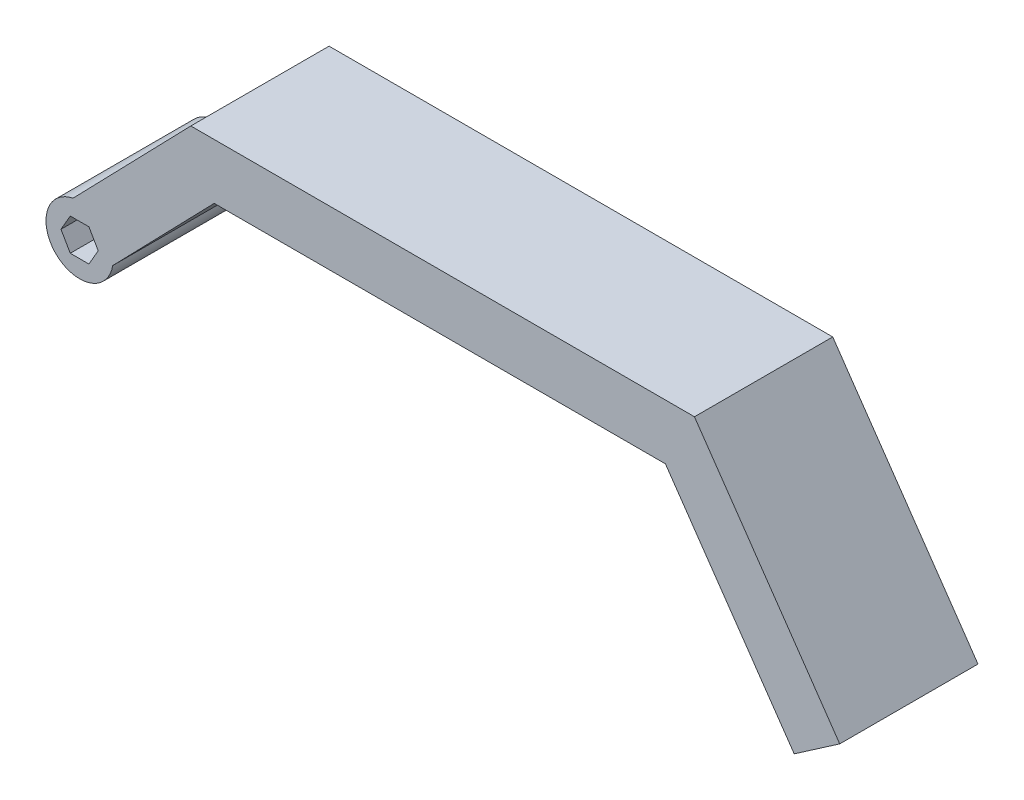
ISO-10303-21;
HEADER;
FILE_DESCRIPTION(('STEP AP214'),'2;1');
FILE_NAME('part.step','',(''),(''),'','','');
FILE_SCHEMA(('AUTOMOTIVE_DESIGN { 1 0 10303 214 1 1 1 1 }'));
ENDSEC;
DATA;
#1=APPLICATION_CONTEXT('core data for automotive mechanical design processes');
#2=APPLICATION_PROTOCOL_DEFINITION('international standard','automotive_design',2000,#1);
#3=PRODUCT_CONTEXT('',#1,'mechanical');
#4=PRODUCT('Part','Part','',(#3));
#5=PRODUCT_RELATED_PRODUCT_CATEGORY('part','',(#4));
#6=PRODUCT_DEFINITION_FORMATION('','',#4);
#7=PRODUCT_DEFINITION_CONTEXT('part definition',#1,'design');
#8=PRODUCT_DEFINITION('design','',#6,#7);
#9=PRODUCT_DEFINITION_SHAPE('','',#8);
#10=(LENGTH_UNIT() NAMED_UNIT(*) SI_UNIT(.MILLI.,.METRE.));
#11=(NAMED_UNIT(*) PLANE_ANGLE_UNIT() SI_UNIT($,.RADIAN.));
#12=(NAMED_UNIT(*) SI_UNIT($,.STERADIAN.) SOLID_ANGLE_UNIT());
#13=UNCERTAINTY_MEASURE_WITH_UNIT(LENGTH_MEASURE(1.E-05),#10,'distance_accuracy_value','');
#14=(GEOMETRIC_REPRESENTATION_CONTEXT(3) GLOBAL_UNCERTAINTY_ASSIGNED_CONTEXT((#13)) GLOBAL_UNIT_ASSIGNED_CONTEXT((#10,
#11,#12)) REPRESENTATION_CONTEXT('',''));
#15=CARTESIAN_POINT('',(0.,0.,0.));
#16=DIRECTION('',(0.,0.,1.));
#17=DIRECTION('',(1.,0.,0.));
#18=AXIS2_PLACEMENT_3D('',#15,#16,#17);
#19=CARTESIAN_POINT('',(0.,0.,30.));
#20=DIRECTION('',(0.,0.,1.));
#21=DIRECTION('',(1.,0.,0.));
#22=AXIS2_PLACEMENT_3D('',#19,#20,#21);
#23=PLANE('',#22);
#24=CARTESIAN_POINT('',(0.,0.,30.));
#25=DIRECTION('',(0.,0.,1.));
#26=DIRECTION('',(1.,0.,0.));
#27=AXIS2_PLACEMENT_3D('',#24,#25,#26);
#28=CIRCLE('',#27,7.28888457866052);
#29=CARTESIAN_POINT('',(-1.42587573705897,7.1480568536842,30.));
#30=VERTEX_POINT('',#29);
#31=CARTESIAN_POINT('',(7.18837747005059,-1.20626189076185,30.));
#32=VERTEX_POINT('',#31);
#33=EDGE_CURVE('E191',#30,#32,#28,.T.);
#34=ORIENTED_EDGE('',*,*,#33,.T.);
#35=DIRECTION('',(0.696193228703838,0.717854433925797,0.));
#36=VECTOR('',#35,1.);
#37=CARTESIAN_POINT('',(7.18837747005059,-1.20626189076185,30.));
#38=LINE('',#37,#36);
#39=CARTESIAN_POINT('',(29.2083828841237,21.4988691990535,30.));
#40=VERTEX_POINT('',#39);
#41=EDGE_CURVE('E194',#32,#40,#38,.T.);
#42=ORIENTED_EDGE('',*,*,#41,.T.);
#43=DIRECTION('',(1.,0.,0.));
#44=VECTOR('',#43,1.);
#45=CARTESIAN_POINT('',(29.2083828841237,21.4988691990535,30.));
#46=LINE('',#45,#44);
#47=CARTESIAN_POINT('',(127.116350116428,21.4988691990535,30.));
#48=VERTEX_POINT('',#47);
#49=EDGE_CURVE('E197',#40,#48,#46,.T.);
#50=ORIENTED_EDGE('',*,*,#49,.T.);
#51=DIRECTION('',(0.567658921463079,-0.823263839169056,0.));
#52=VECTOR('',#51,1.);
#53=CARTESIAN_POINT('',(127.116350116428,21.4988691990535,30.));
#54=LINE('',#53,#52);
#55=CARTESIAN_POINT('',(155.060416964986,-19.0278254161676,30.));
#56=VERTEX_POINT('',#55);
#57=EDGE_CURVE('E199',#48,#56,#54,.T.);
#58=ORIENTED_EDGE('',*,*,#57,.T.);
#59=DIRECTION('',(0.823263839169057,0.567658921463078,0.));
#60=VECTOR('',#59,1.);
#61=CARTESIAN_POINT('',(155.060416964986,-19.0278254161676,30.));
#62=LINE('',#61,#60);
#63=CARTESIAN_POINT('',(164.939583035014,-12.2159183586107,30.));
#64=VERTEX_POINT('',#63);
#65=EDGE_CURVE('E201',#56,#64,#62,.T.);
#66=ORIENTED_EDGE('',*,*,#65,.T.);
#67=DIRECTION('',(-0.567658921463079,0.823263839169056,0.));
#68=VECTOR('',#67,1.);
#69=CARTESIAN_POINT('',(133.418209490793,33.4988691990535,30.));
#70=LINE('',#69,#68);
#71=CARTESIAN_POINT('',(133.418209490793,33.4988691990535,30.));
#72=VERTEX_POINT('',#71);
#73=EDGE_CURVE('E203',#64,#72,#70,.T.);
#74=ORIENTED_EDGE('',*,*,#73,.T.);
#75=DIRECTION('',(-1.,0.,0.));
#76=VECTOR('',#75,1.);
#77=CARTESIAN_POINT('',(24.1298027664019,33.4988691990535,30.));
#78=LINE('',#77,#76);
#79=CARTESIAN_POINT('',(24.1298027664019,33.4988691990535,30.));
#80=VERTEX_POINT('',#79);
#81=EDGE_CURVE('E205',#72,#80,#78,.T.);
#82=ORIENTED_EDGE('',*,*,#81,.T.);
#83=DIRECTION('',(-0.696193228703838,-0.717854433925797,0.));
#84=VECTOR('',#83,1.);
#85=CARTESIAN_POINT('',(-1.42587573705897,7.1480568536842,30.));
#86=LINE('',#85,#84);
#87=EDGE_CURVE('E207',#80,#30,#86,.T.);
#88=ORIENTED_EDGE('',*,*,#87,.T.);
#89=EDGE_LOOP('',(#34,#42,#50,#58,#66,#74,#82,#88));
#90=FACE_BOUND('',#89,.T.);
#91=DIRECTION('',(-0.500000000000001,0.866025403784438,0.));
#92=VECTOR('',#91,1.);
#93=CARTESIAN_POINT('',(4.04145188432736,0.,30.));
#94=LINE('',#93,#92);
#95=CARTESIAN_POINT('',(4.04145188432736,0.,30.));
#96=VERTEX_POINT('',#95);
#97=CARTESIAN_POINT('',(2.02072594216367,3.49999999999999,30.));
#98=VERTEX_POINT('',#97);
#99=EDGE_CURVE('E148',#96,#98,#94,.T.);
#100=ORIENTED_EDGE('',*,*,#99,.F.);
#101=DIRECTION('',(0.499999999999995,0.866025403784441,0.));
#102=VECTOR('',#101,1.);
#103=CARTESIAN_POINT('',(2.02072594216372,-3.49999999999996,30.));
#104=LINE('',#103,#102);
#105=CARTESIAN_POINT('',(2.02072594216372,-3.49999999999996,30.));
#106=VERTEX_POINT('',#105);
#107=EDGE_CURVE('E140',#106,#96,#104,.T.);
#108=ORIENTED_EDGE('',*,*,#107,.F.);
#109=DIRECTION('',(1.,0.,0.));
#110=VECTOR('',#109,1.);
#111=CARTESIAN_POINT('',(-2.02072594216365,-3.5,30.));
#112=LINE('',#111,#110);
#113=CARTESIAN_POINT('',(-2.02072594216365,-3.5,30.));
#114=VERTEX_POINT('',#113);
#115=EDGE_CURVE('E169',#114,#106,#112,.T.);
#116=ORIENTED_EDGE('',*,*,#115,.F.);
#117=DIRECTION('',(0.500000000000007,-0.866025403784435,0.));
#118=VECTOR('',#117,1.);
#119=CARTESIAN_POINT('',(-4.04145188432736,0.,30.));
#120=LINE('',#119,#118);
#121=CARTESIAN_POINT('',(-4.04145188432736,0.,30.));
#122=VERTEX_POINT('',#121);
#123=EDGE_CURVE('E167',#122,#114,#120,.T.);
#124=ORIENTED_EDGE('',*,*,#123,.F.);
#125=DIRECTION('',(-0.499999999999995,-0.866025403784442,0.));
#126=VECTOR('',#125,1.);
#127=CARTESIAN_POINT('',(-2.0207259421637,3.49999999999997,30.));
#128=LINE('',#127,#126);
#129=CARTESIAN_POINT('',(-2.0207259421637,3.49999999999997,30.));
#130=VERTEX_POINT('',#129);
#131=EDGE_CURVE('E163',#130,#122,#128,.T.);
#132=ORIENTED_EDGE('',*,*,#131,.F.);
#133=DIRECTION('',(-1.,0.,0.));
#134=VECTOR('',#133,1.);
#135=CARTESIAN_POINT('',(2.02072594216367,3.49999999999999,30.));
#136=LINE('',#135,#134);
#137=EDGE_CURVE('E161',#98,#130,#136,.T.);
#138=ORIENTED_EDGE('',*,*,#137,.F.);
#139=EDGE_LOOP('',(#100,#108,#116,#124,#132,#138));
#140=FACE_BOUND('',#139,.T.);
#141=ADVANCED_FACE('F39',(#90,#140),#23,.T.);
#142=CARTESIAN_POINT('',(0.,0.,0.));
#143=DIRECTION('',(0.,0.,1.));
#144=DIRECTION('',(1.,0.,0.));
#145=AXIS2_PLACEMENT_3D('',#142,#143,#144);
#146=PLANE('',#145);
#147=CARTESIAN_POINT('',(0.,0.,0.));
#148=DIRECTION('',(0.,0.,1.));
#149=DIRECTION('',(1.,0.,0.));
#150=AXIS2_PLACEMENT_3D('',#147,#148,#149);
#151=CIRCLE('',#150,7.28888457866052);
#152=CARTESIAN_POINT('',(-1.42587573705897,7.1480568536842,0.));
#153=VERTEX_POINT('',#152);
#154=CARTESIAN_POINT('',(7.18837747005059,-1.20626189076185,0.));
#155=VERTEX_POINT('',#154);
#156=EDGE_CURVE('E156',#153,#155,#151,.T.);
#157=ORIENTED_EDGE('',*,*,#156,.F.);
#158=DIRECTION('',(-0.696193228703838,-0.717854433925797,0.));
#159=VECTOR('',#158,1.);
#160=CARTESIAN_POINT('',(-1.42587573705897,7.1480568536842,0.));
#161=LINE('',#160,#159);
#162=CARTESIAN_POINT('',(24.1298027664019,33.4988691990535,0.));
#163=VERTEX_POINT('',#162);
#164=EDGE_CURVE('E195',#163,#153,#161,.T.);
#165=ORIENTED_EDGE('',*,*,#164,.F.);
#166=DIRECTION('',(-1.,0.,0.));
#167=VECTOR('',#166,1.);
#168=CARTESIAN_POINT('',(24.1298027664019,33.4988691990535,0.));
#169=LINE('',#168,#167);
#170=CARTESIAN_POINT('',(133.418209490793,33.4988691990535,0.));
#171=VERTEX_POINT('',#170);
#172=EDGE_CURVE('E222',#171,#163,#169,.T.);
#173=ORIENTED_EDGE('',*,*,#172,.F.);
#174=DIRECTION('',(-0.567658921463079,0.823263839169056,0.));
#175=VECTOR('',#174,1.);
#176=CARTESIAN_POINT('',(133.418209490793,33.4988691990535,0.));
#177=LINE('',#176,#175);
#178=CARTESIAN_POINT('',(164.939583035014,-12.2159183586107,0.));
#179=VERTEX_POINT('',#178);
#180=EDGE_CURVE('E220',#179,#171,#177,.T.);
#181=ORIENTED_EDGE('',*,*,#180,.F.);
#182=DIRECTION('',(0.823263839169057,0.567658921463078,0.));
#183=VECTOR('',#182,1.);
#184=CARTESIAN_POINT('',(155.060416964986,-19.0278254161676,0.));
#185=LINE('',#184,#183);
#186=CARTESIAN_POINT('',(155.060416964986,-19.0278254161676,0.));
#187=VERTEX_POINT('',#186);
#188=EDGE_CURVE('E218',#187,#179,#185,.T.);
#189=ORIENTED_EDGE('',*,*,#188,.F.);
#190=DIRECTION('',(0.567658921463079,-0.823263839169056,0.));
#191=VECTOR('',#190,1.);
#192=CARTESIAN_POINT('',(127.116350116428,21.4988691990535,0.));
#193=LINE('',#192,#191);
#194=CARTESIAN_POINT('',(127.116350116428,21.4988691990535,0.));
#195=VERTEX_POINT('',#194);
#196=EDGE_CURVE('E216',#195,#187,#193,.T.);
#197=ORIENTED_EDGE('',*,*,#196,.F.);
#198=DIRECTION('',(1.,0.,0.));
#199=VECTOR('',#198,1.);
#200=CARTESIAN_POINT('',(29.2083828841237,21.4988691990535,0.));
#201=LINE('',#200,#199);
#202=CARTESIAN_POINT('',(29.2083828841237,21.4988691990535,0.));
#203=VERTEX_POINT('',#202);
#204=EDGE_CURVE('E214',#203,#195,#201,.T.);
#205=ORIENTED_EDGE('',*,*,#204,.F.);
#206=DIRECTION('',(0.696193228703838,0.717854433925797,0.));
#207=VECTOR('',#206,1.);
#208=CARTESIAN_POINT('',(7.18837747005059,-1.20626189076185,0.));
#209=LINE('',#208,#207);
#210=EDGE_CURVE('E212',#155,#203,#209,.T.);
#211=ORIENTED_EDGE('',*,*,#210,.F.);
#212=EDGE_LOOP('',(#157,#165,#173,#181,#189,#197,#205,#211));
#213=FACE_BOUND('',#212,.T.);
#214=DIRECTION('',(0.499999999999995,0.866025403784441,0.));
#215=VECTOR('',#214,1.);
#216=CARTESIAN_POINT('',(2.02072594216372,-3.49999999999996,0.));
#217=LINE('',#216,#215);
#218=CARTESIAN_POINT('',(2.02072594216372,-3.49999999999996,0.));
#219=VERTEX_POINT('',#218);
#220=CARTESIAN_POINT('',(4.04145188432736,0.,0.));
#221=VERTEX_POINT('',#220);
#222=EDGE_CURVE('E62',#219,#221,#217,.T.);
#223=ORIENTED_EDGE('',*,*,#222,.T.);
#224=DIRECTION('',(-0.500000000000001,0.866025403784438,0.));
#225=VECTOR('',#224,1.);
#226=CARTESIAN_POINT('',(4.04145188432736,0.,0.));
#227=LINE('',#226,#225);
#228=CARTESIAN_POINT('',(2.02072594216367,3.49999999999999,0.));
#229=VERTEX_POINT('',#228);
#230=EDGE_CURVE('E155',#221,#229,#227,.T.);
#231=ORIENTED_EDGE('',*,*,#230,.T.);
#232=DIRECTION('',(-1.,0.,0.));
#233=VECTOR('',#232,1.);
#234=CARTESIAN_POINT('',(2.02072594216367,3.49999999999999,0.));
#235=LINE('',#234,#233);
#236=CARTESIAN_POINT('',(-2.0207259421637,3.49999999999997,0.));
#237=VERTEX_POINT('',#236);
#238=EDGE_CURVE('E173',#229,#237,#235,.T.);
#239=ORIENTED_EDGE('',*,*,#238,.T.);
#240=DIRECTION('',(-0.499999999999995,-0.866025403784442,0.));
#241=VECTOR('',#240,1.);
#242=CARTESIAN_POINT('',(-2.0207259421637,3.49999999999997,0.));
#243=LINE('',#242,#241);
#244=CARTESIAN_POINT('',(-4.04145188432736,0.,0.));
#245=VERTEX_POINT('',#244);
#246=EDGE_CURVE('E176',#237,#245,#243,.T.);
#247=ORIENTED_EDGE('',*,*,#246,.T.);
#248=DIRECTION('',(0.500000000000007,-0.866025403784435,0.));
#249=VECTOR('',#248,1.);
#250=CARTESIAN_POINT('',(-4.04145188432736,0.,0.));
#251=LINE('',#250,#249);
#252=CARTESIAN_POINT('',(-2.02072594216365,-3.5,0.));
#253=VERTEX_POINT('',#252);
#254=EDGE_CURVE('E179',#245,#253,#251,.T.);
#255=ORIENTED_EDGE('',*,*,#254,.T.);
#256=DIRECTION('',(1.,0.,0.));
#257=VECTOR('',#256,1.);
#258=CARTESIAN_POINT('',(-2.02072594216365,-3.5,0.));
#259=LINE('',#258,#257);
#260=EDGE_CURVE('E149',#253,#219,#259,.T.);
#261=ORIENTED_EDGE('',*,*,#260,.T.);
#262=EDGE_LOOP('',(#223,#231,#239,#247,#255,#261));
#263=FACE_BOUND('',#262,.T.);
#264=ADVANCED_FACE('F252',(#213,#263),#146,.F.);
#265=CARTESIAN_POINT('',(0.,0.,30.));
#266=DIRECTION('',(0.,0.,-1.));
#267=DIRECTION('',(-1.,0.,0.));
#268=AXIS2_PLACEMENT_3D('',#265,#266,#267);
#269=CYLINDRICAL_SURFACE('',#268,7.28888457866052);
#270=ORIENTED_EDGE('',*,*,#156,.T.);
#271=DIRECTION('',(0.,0.,-1.));
#272=VECTOR('',#271,1.);
#273=CARTESIAN_POINT('',(7.18837747005059,-1.20626189076185,30.));
#274=LINE('',#273,#272);
#275=EDGE_CURVE('E11',#32,#155,#274,.T.);
#276=ORIENTED_EDGE('',*,*,#275,.F.);
#277=ORIENTED_EDGE('',*,*,#33,.F.);
#278=DIRECTION('',(0.,0.,-1.));
#279=VECTOR('',#278,1.);
#280=CARTESIAN_POINT('',(-1.42587573705897,7.1480568536842,30.));
#281=LINE('',#280,#279);
#282=EDGE_CURVE('E209',#30,#153,#281,.T.);
#283=ORIENTED_EDGE('',*,*,#282,.T.);
#284=EDGE_LOOP('',(#270,#276,#277,#283));
#285=FACE_BOUND('',#284,.T.);
#286=ADVANCED_FACE('F41',(#285),#269,.T.);
#287=CARTESIAN_POINT('',(7.18837747005059,-1.20626189076185,30.));
#288=DIRECTION('',(-0.717854433925797,0.696193228703838,0.));
#289=DIRECTION('',(-0.696193228703838,-0.717854433925797,0.));
#290=AXIS2_PLACEMENT_3D('',#287,#288,#289);
#291=PLANE('',#290);
#292=ORIENTED_EDGE('',*,*,#210,.T.);
#293=DIRECTION('',(0.,0.,-1.));
#294=VECTOR('',#293,1.);
#295=CARTESIAN_POINT('',(29.2083828841237,21.4988691990535,30.));
#296=LINE('',#295,#294);
#297=EDGE_CURVE('E47',#40,#203,#296,.T.);
#298=ORIENTED_EDGE('',*,*,#297,.F.);
#299=ORIENTED_EDGE('',*,*,#41,.F.);
#300=ORIENTED_EDGE('',*,*,#275,.T.);
#301=EDGE_LOOP('',(#292,#298,#299,#300));
#302=FACE_BOUND('',#301,.T.);
#303=ADVANCED_FACE('F269',(#302),#291,.F.);
#304=CARTESIAN_POINT('',(29.2083828841237,21.4988691990535,30.));
#305=DIRECTION('',(0.,1.,0.));
#306=DIRECTION('',(0.,0.,1.));
#307=AXIS2_PLACEMENT_3D('',#304,#305,#306);
#308=PLANE('',#307);
#309=ORIENTED_EDGE('',*,*,#204,.T.);
#310=DIRECTION('',(0.,0.,-1.));
#311=VECTOR('',#310,1.);
#312=CARTESIAN_POINT('',(127.116350116428,21.4988691990535,30.));
#313=LINE('',#312,#311);
#314=EDGE_CURVE('E239',#48,#195,#313,.T.);
#315=ORIENTED_EDGE('',*,*,#314,.F.);
#316=ORIENTED_EDGE('',*,*,#49,.F.);
#317=ORIENTED_EDGE('',*,*,#297,.T.);
#318=EDGE_LOOP('',(#309,#315,#316,#317));
#319=FACE_BOUND('',#318,.T.);
#320=ADVANCED_FACE('F246',(#319),#308,.F.);
#321=CARTESIAN_POINT('',(127.116350116428,21.4988691990535,30.));
#322=DIRECTION('',(0.823263839169056,0.567658921463079,0.));
#323=DIRECTION('',(-0.567658921463079,0.823263839169056,0.));
#324=AXIS2_PLACEMENT_3D('',#321,#322,#323);
#325=PLANE('',#324);
#326=ORIENTED_EDGE('',*,*,#196,.T.);
#327=DIRECTION('',(0.,0.,-1.));
#328=VECTOR('',#327,1.);
#329=CARTESIAN_POINT('',(155.060416964986,-19.0278254161676,30.));
#330=LINE('',#329,#328);
#331=EDGE_CURVE('E236',#56,#187,#330,.T.);
#332=ORIENTED_EDGE('',*,*,#331,.F.);
#333=ORIENTED_EDGE('',*,*,#57,.F.);
#334=ORIENTED_EDGE('',*,*,#314,.T.);
#335=EDGE_LOOP('',(#326,#332,#333,#334));
#336=FACE_BOUND('',#335,.T.);
#337=ADVANCED_FACE('F258',(#336),#325,.F.);
#338=CARTESIAN_POINT('',(155.060416964986,-19.0278254161676,30.));
#339=DIRECTION('',(-0.567658921463078,0.823263839169057,0.));
#340=DIRECTION('',(-0.823263839169057,-0.567658921463078,0.));
#341=AXIS2_PLACEMENT_3D('',#338,#339,#340);
#342=PLANE('',#341);
#343=ORIENTED_EDGE('',*,*,#188,.T.);
#344=DIRECTION('',(0.,0.,-1.));
#345=VECTOR('',#344,1.);
#346=CARTESIAN_POINT('',(164.939583035014,-12.2159183586107,30.));
#347=LINE('',#346,#345);
#348=EDGE_CURVE('E233',#64,#179,#347,.T.);
#349=ORIENTED_EDGE('',*,*,#348,.F.);
#350=ORIENTED_EDGE('',*,*,#65,.F.);
#351=ORIENTED_EDGE('',*,*,#331,.T.);
#352=EDGE_LOOP('',(#343,#349,#350,#351));
#353=FACE_BOUND('',#352,.T.);
#354=ADVANCED_FACE('F262',(#353),#342,.F.);
#355=CARTESIAN_POINT('',(133.418209490793,33.4988691990535,30.));
#356=DIRECTION('',(-0.823263839169056,-0.567658921463079,0.));
#357=DIRECTION('',(0.567658921463079,-0.823263839169056,0.));
#358=AXIS2_PLACEMENT_3D('',#355,#356,#357);
#359=PLANE('',#358);
#360=ORIENTED_EDGE('',*,*,#180,.T.);
#361=DIRECTION('',(0.,0.,-1.));
#362=VECTOR('',#361,1.);
#363=CARTESIAN_POINT('',(133.418209490793,33.4988691990535,30.));
#364=LINE('',#363,#362);
#365=EDGE_CURVE('E230',#72,#171,#364,.T.);
#366=ORIENTED_EDGE('',*,*,#365,.F.);
#367=ORIENTED_EDGE('',*,*,#73,.F.);
#368=ORIENTED_EDGE('',*,*,#348,.T.);
#369=EDGE_LOOP('',(#360,#366,#367,#368));
#370=FACE_BOUND('',#369,.T.);
#371=ADVANCED_FACE('F282',(#370),#359,.F.);
#372=CARTESIAN_POINT('',(24.1298027664019,33.4988691990535,30.));
#373=DIRECTION('',(0.,-1.,0.));
#374=DIRECTION('',(1.,0.,0.));
#375=AXIS2_PLACEMENT_3D('',#372,#373,#374);
#376=PLANE('',#375);
#377=ORIENTED_EDGE('',*,*,#172,.T.);
#378=DIRECTION('',(0.,0.,-1.));
#379=VECTOR('',#378,1.);
#380=CARTESIAN_POINT('',(24.1298027664019,33.4988691990535,30.));
#381=LINE('',#380,#379);
#382=EDGE_CURVE('E227',#80,#163,#381,.T.);
#383=ORIENTED_EDGE('',*,*,#382,.F.);
#384=ORIENTED_EDGE('',*,*,#81,.F.);
#385=ORIENTED_EDGE('',*,*,#365,.T.);
#386=EDGE_LOOP('',(#377,#383,#384,#385));
#387=FACE_BOUND('',#386,.T.);
#388=ADVANCED_FACE('F280',(#387),#376,.F.);
#389=CARTESIAN_POINT('',(-1.42587573705897,7.1480568536842,30.));
#390=DIRECTION('',(0.717854433925797,-0.696193228703838,0.));
#391=DIRECTION('',(0.696193228703838,0.717854433925797,0.));
#392=AXIS2_PLACEMENT_3D('',#389,#390,#391);
#393=PLANE('',#392);
#394=ORIENTED_EDGE('',*,*,#164,.T.);
#395=ORIENTED_EDGE('',*,*,#282,.F.);
#396=ORIENTED_EDGE('',*,*,#87,.F.);
#397=ORIENTED_EDGE('',*,*,#382,.T.);
#398=EDGE_LOOP('',(#394,#395,#396,#397));
#399=FACE_BOUND('',#398,.T.);
#400=ADVANCED_FACE('F275',(#399),#393,.F.);
#401=CARTESIAN_POINT('',(2.02072594216372,-3.49999999999996,30.));
#402=DIRECTION('',(-0.866025403784441,0.499999999999995,0.));
#403=DIRECTION('',(-0.499999999999995,-0.866025403784441,0.));
#404=AXIS2_PLACEMENT_3D('',#401,#402,#403);
#405=PLANE('',#404);
#406=ORIENTED_EDGE('',*,*,#222,.F.);
#407=DIRECTION('',(0.,0.,-1.));
#408=VECTOR('',#407,1.);
#409=CARTESIAN_POINT('',(2.02072594216372,-3.49999999999996,30.));
#410=LINE('',#409,#408);
#411=EDGE_CURVE('E144',#106,#219,#410,.T.);
#412=ORIENTED_EDGE('',*,*,#411,.F.);
#413=ORIENTED_EDGE('',*,*,#107,.T.);
#414=DIRECTION('',(0.,0.,-1.));
#415=VECTOR('',#414,1.);
#416=CARTESIAN_POINT('',(4.04145188432736,0.,30.));
#417=LINE('',#416,#415);
#418=EDGE_CURVE('E143',#96,#221,#417,.T.);
#419=ORIENTED_EDGE('',*,*,#418,.T.);
#420=EDGE_LOOP('',(#406,#412,#413,#419));
#421=FACE_BOUND('',#420,.T.);
#422=ADVANCED_FACE('F142',(#421),#405,.T.);
#423=CARTESIAN_POINT('',(4.04145188432736,0.,30.));
#424=DIRECTION('',(-0.866025403784438,-0.500000000000001,0.));
#425=DIRECTION('',(0.500000000000001,-0.866025403784438,0.));
#426=AXIS2_PLACEMENT_3D('',#423,#424,#425);
#427=PLANE('',#426);
#428=ORIENTED_EDGE('',*,*,#230,.F.);
#429=ORIENTED_EDGE('',*,*,#418,.F.);
#430=ORIENTED_EDGE('',*,*,#99,.T.);
#431=DIRECTION('',(0.,0.,-1.));
#432=VECTOR('',#431,1.);
#433=CARTESIAN_POINT('',(2.02072594216367,3.49999999999999,30.));
#434=LINE('',#433,#432);
#435=EDGE_CURVE('E157',#98,#229,#434,.T.);
#436=ORIENTED_EDGE('',*,*,#435,.T.);
#437=EDGE_LOOP('',(#428,#429,#430,#436));
#438=FACE_BOUND('',#437,.T.);
#439=ADVANCED_FACE('F152',(#438),#427,.T.);
#440=CARTESIAN_POINT('',(2.02072594216367,3.49999999999999,30.));
#441=DIRECTION('',(0.,-1.,0.));
#442=DIRECTION('',(1.,0.,0.));
#443=AXIS2_PLACEMENT_3D('',#440,#441,#442);
#444=PLANE('',#443);
#445=ORIENTED_EDGE('',*,*,#238,.F.);
#446=ORIENTED_EDGE('',*,*,#435,.F.);
#447=ORIENTED_EDGE('',*,*,#137,.T.);
#448=DIRECTION('',(0.,0.,-1.));
#449=VECTOR('',#448,1.);
#450=CARTESIAN_POINT('',(-2.0207259421637,3.49999999999997,30.));
#451=LINE('',#450,#449);
#452=EDGE_CURVE('E188',#130,#237,#451,.T.);
#453=ORIENTED_EDGE('',*,*,#452,.T.);
#454=EDGE_LOOP('',(#445,#446,#447,#453));
#455=FACE_BOUND('',#454,.T.);
#456=ADVANCED_FACE('F307',(#455),#444,.T.);
#457=CARTESIAN_POINT('',(-2.0207259421637,3.49999999999997,30.));
#458=DIRECTION('',(0.866025403784441,-0.499999999999995,0.));
#459=DIRECTION('',(0.499999999999995,0.866025403784442,0.));
#460=AXIS2_PLACEMENT_3D('',#457,#458,#459);
#461=PLANE('',#460);
#462=ORIENTED_EDGE('',*,*,#246,.F.);
#463=ORIENTED_EDGE('',*,*,#452,.F.);
#464=ORIENTED_EDGE('',*,*,#131,.T.);
#465=DIRECTION('',(0.,0.,-1.));
#466=VECTOR('',#465,1.);
#467=CARTESIAN_POINT('',(-4.04145188432736,0.,30.));
#468=LINE('',#467,#466);
#469=EDGE_CURVE('E186',#122,#245,#468,.T.);
#470=ORIENTED_EDGE('',*,*,#469,.T.);
#471=EDGE_LOOP('',(#462,#463,#464,#470));
#472=FACE_BOUND('',#471,.T.);
#473=ADVANCED_FACE('F311',(#472),#461,.T.);
#474=CARTESIAN_POINT('',(-4.04145188432736,0.,30.));
#475=DIRECTION('',(0.866025403784435,0.500000000000007,0.));
#476=DIRECTION('',(-0.500000000000007,0.866025403784435,0.));
#477=AXIS2_PLACEMENT_3D('',#474,#475,#476);
#478=PLANE('',#477);
#479=ORIENTED_EDGE('',*,*,#254,.F.);
#480=ORIENTED_EDGE('',*,*,#469,.F.);
#481=ORIENTED_EDGE('',*,*,#123,.T.);
#482=DIRECTION('',(0.,0.,-1.));
#483=VECTOR('',#482,1.);
#484=CARTESIAN_POINT('',(-2.02072594216365,-3.5,30.));
#485=LINE('',#484,#483);
#486=EDGE_CURVE('E54',#114,#253,#485,.T.);
#487=ORIENTED_EDGE('',*,*,#486,.T.);
#488=EDGE_LOOP('',(#479,#480,#481,#487));
#489=FACE_BOUND('',#488,.T.);
#490=ADVANCED_FACE('F317',(#489),#478,.T.);
#491=CARTESIAN_POINT('',(-2.02072594216365,-3.5,30.));
#492=DIRECTION('',(0.,1.,0.));
#493=DIRECTION('',(-1.,0.,0.));
#494=AXIS2_PLACEMENT_3D('',#491,#492,#493);
#495=PLANE('',#494);
#496=ORIENTED_EDGE('',*,*,#260,.F.);
#497=ORIENTED_EDGE('',*,*,#486,.F.);
#498=ORIENTED_EDGE('',*,*,#115,.T.);
#499=ORIENTED_EDGE('',*,*,#411,.T.);
#500=EDGE_LOOP('',(#496,#497,#498,#499));
#501=FACE_BOUND('',#500,.T.);
#502=ADVANCED_FACE('F321',(#501),#495,.T.);
#503=CLOSED_SHELL('',(#141,#264,#286,#303,#320,#337,#354,#371,#388,#400,#422,#439,#456,#473,
#490,#502));
#504=MANIFOLD_SOLID_BREP('B2',#503);
#505=ADVANCED_BREP_SHAPE_REPRESENTATION('',(#18,#504),#14);
#506=SHAPE_DEFINITION_REPRESENTATION(#9,#505);
ENDSEC;
END-ISO-10303-21;
